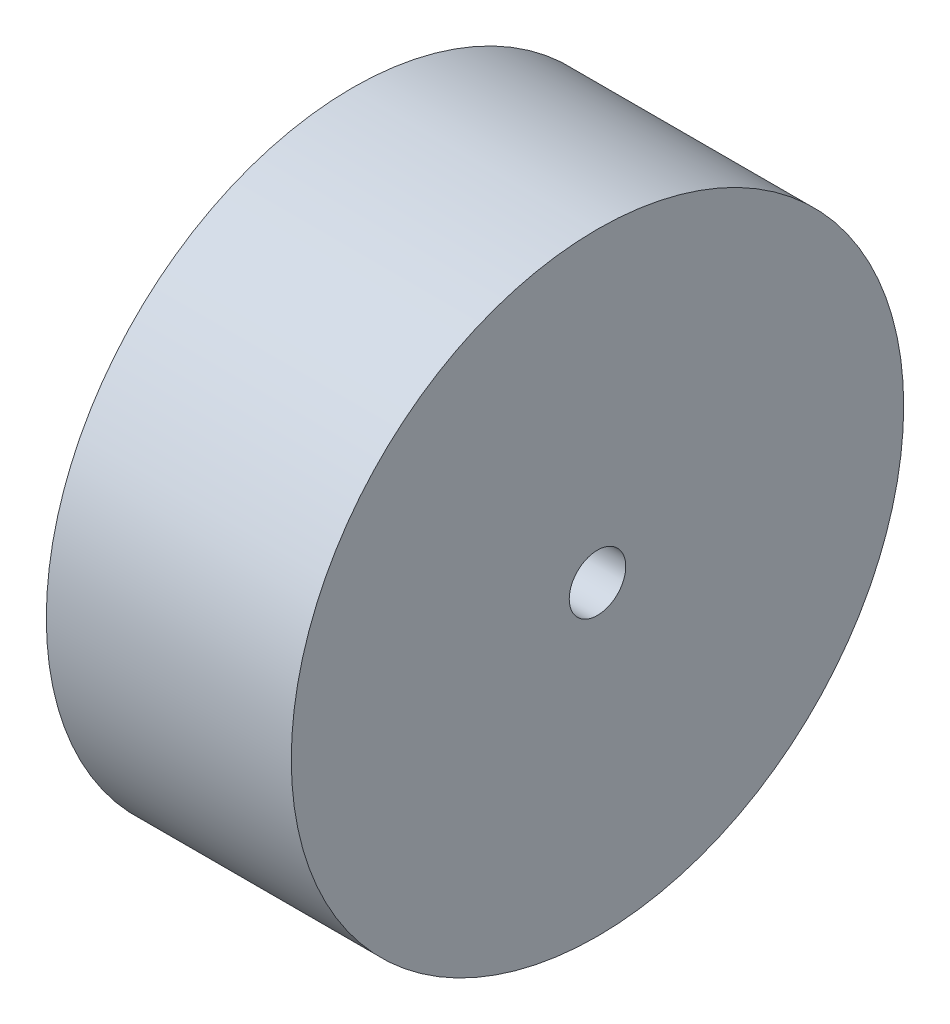
ISO-10303-21;
HEADER;
FILE_DESCRIPTION(('STEP AP214'),'2;1');
FILE_NAME('part.step','',(''),(''),'','','');
FILE_SCHEMA(('AUTOMOTIVE_DESIGN { 1 0 10303 214 1 1 1 1 }'));
ENDSEC;
DATA;
#1=APPLICATION_CONTEXT('core data for automotive mechanical design processes');
#2=APPLICATION_PROTOCOL_DEFINITION('international standard','automotive_design',2000,#1);
#3=PRODUCT_CONTEXT('',#1,'mechanical');
#4=PRODUCT('Part','Part','',(#3));
#5=PRODUCT_RELATED_PRODUCT_CATEGORY('part','',(#4));
#6=PRODUCT_DEFINITION_FORMATION('','',#4);
#7=PRODUCT_DEFINITION_CONTEXT('part definition',#1,'design');
#8=PRODUCT_DEFINITION('design','',#6,#7);
#9=PRODUCT_DEFINITION_SHAPE('','',#8);
#10=(LENGTH_UNIT() NAMED_UNIT(*) SI_UNIT(.MILLI.,.METRE.));
#11=(NAMED_UNIT(*) PLANE_ANGLE_UNIT() SI_UNIT($,.RADIAN.));
#12=(NAMED_UNIT(*) SI_UNIT($,.STERADIAN.) SOLID_ANGLE_UNIT());
#13=UNCERTAINTY_MEASURE_WITH_UNIT(LENGTH_MEASURE(1.E-05),#10,'distance_accuracy_value','');
#14=(GEOMETRIC_REPRESENTATION_CONTEXT(3) GLOBAL_UNCERTAINTY_ASSIGNED_CONTEXT((#13)) GLOBAL_UNIT_ASSIGNED_CONTEXT((#10,
#11,#12)) REPRESENTATION_CONTEXT('',''));
#15=CARTESIAN_POINT('',(0.,0.,0.));
#16=DIRECTION('',(0.,0.,1.));
#17=DIRECTION('',(1.,0.,0.));
#18=AXIS2_PLACEMENT_3D('',#15,#16,#17);
#19=CARTESIAN_POINT('',(26.,0.,0.));
#20=DIRECTION('',(1.,0.,0.));
#21=DIRECTION('',(0.,0.,-1.));
#22=AXIS2_PLACEMENT_3D('',#19,#20,#21);
#23=PLANE('',#22);
#24=CARTESIAN_POINT('',(26.,0.,0.));
#25=DIRECTION('',(1.,0.,0.));
#26=DIRECTION('',(0.,0.,-1.));
#27=AXIS2_PLACEMENT_3D('',#24,#25,#26);
#28=CIRCLE('',#27,32.5);
#29=CARTESIAN_POINT('',(26.,0.,32.5));
#30=VERTEX_POINT('',#29);
#31=EDGE_CURVE('E11',#30,#30,#28,.T.);
#32=ORIENTED_EDGE('',*,*,#31,.T.);
#33=EDGE_LOOP('',(#32));
#34=FACE_BOUND('',#33,.T.);
#35=CARTESIAN_POINT('',(26.,0.,0.));
#36=DIRECTION('',(1.,0.,0.));
#37=DIRECTION('',(0.,0.,-1.));
#38=AXIS2_PLACEMENT_3D('',#35,#36,#37);
#39=CIRCLE('',#38,3.);
#40=CARTESIAN_POINT('',(26.,0.,3.));
#41=VERTEX_POINT('',#40);
#42=EDGE_CURVE('E49',#41,#41,#39,.T.);
#43=ORIENTED_EDGE('',*,*,#42,.F.);
#44=EDGE_LOOP('',(#43));
#45=FACE_BOUND('',#44,.T.);
#46=ADVANCED_FACE('F38',(#34,#45),#23,.T.);
#47=CARTESIAN_POINT('',(0.,0.,0.));
#48=DIRECTION('',(1.,0.,0.));
#49=DIRECTION('',(0.,0.,-1.));
#50=AXIS2_PLACEMENT_3D('',#47,#48,#49);
#51=PLANE('',#50);
#52=CARTESIAN_POINT('',(0.,0.,0.));
#53=DIRECTION('',(1.,0.,0.));
#54=DIRECTION('',(0.,0.,-1.));
#55=AXIS2_PLACEMENT_3D('',#52,#53,#54);
#56=CIRCLE('',#55,32.5);
#57=CARTESIAN_POINT('',(0.,0.,32.5));
#58=VERTEX_POINT('',#57);
#59=EDGE_CURVE('E42',#58,#58,#56,.T.);
#60=ORIENTED_EDGE('',*,*,#59,.F.);
#61=EDGE_LOOP('',(#60));
#62=FACE_BOUND('',#61,.T.);
#63=CARTESIAN_POINT('',(0.,0.,0.));
#64=DIRECTION('',(1.,0.,0.));
#65=DIRECTION('',(0.,0.,-1.));
#66=AXIS2_PLACEMENT_3D('',#63,#64,#65);
#67=CIRCLE('',#66,3.);
#68=CARTESIAN_POINT('',(0.,0.,3.));
#69=VERTEX_POINT('',#68);
#70=EDGE_CURVE('E51',#69,#69,#67,.T.);
#71=ORIENTED_EDGE('',*,*,#70,.T.);
#72=EDGE_LOOP('',(#71));
#73=FACE_BOUND('',#72,.T.);
#74=ADVANCED_FACE('F61',(#62,#73),#51,.F.);
#75=CARTESIAN_POINT('',(26.,0.,0.));
#76=DIRECTION('',(-1.,0.,0.));
#77=DIRECTION('',(0.,0.,1.));
#78=AXIS2_PLACEMENT_3D('',#75,#76,#77);
#79=CYLINDRICAL_SURFACE('',#78,32.5);
#80=CARTESIAN_POINT('',(26.,0.,32.5));
#81=CARTESIAN_POINT('',(25.7291666666667,0.,32.5));
#82=CARTESIAN_POINT('',(25.4583333333333,0.,32.5));
#83=CARTESIAN_POINT('',(24.9166666666667,0.,32.5));
#84=CARTESIAN_POINT('',(24.6458333333333,0.,32.5));
#85=CARTESIAN_POINT('',(24.1041666666667,0.,32.5));
#86=CARTESIAN_POINT('',(23.8333333333333,0.,32.5));
#87=CARTESIAN_POINT('',(23.2916666666667,0.,32.5));
#88=CARTESIAN_POINT('',(23.0208333333333,0.,32.5));
#89=CARTESIAN_POINT('',(22.4791666666667,0.,32.5));
#90=CARTESIAN_POINT('',(22.2083333333333,0.,32.5));
#91=CARTESIAN_POINT('',(21.6666666666667,0.,32.5));
#92=CARTESIAN_POINT('',(21.3958333333333,0.,32.5));
#93=CARTESIAN_POINT('',(20.8541666666667,0.,32.5));
#94=CARTESIAN_POINT('',(20.5833333333333,0.,32.5));
#95=CARTESIAN_POINT('',(20.0416666666667,0.,32.5));
#96=CARTESIAN_POINT('',(19.7708333333333,0.,32.5));
#97=CARTESIAN_POINT('',(19.2291666666667,0.,32.5));
#98=CARTESIAN_POINT('',(18.9583333333333,0.,32.5));
#99=CARTESIAN_POINT('',(18.4166666666667,0.,32.5));
#100=CARTESIAN_POINT('',(18.1458333333333,0.,32.5));
#101=CARTESIAN_POINT('',(17.6041666666667,0.,32.5));
#102=CARTESIAN_POINT('',(17.3333333333333,0.,32.5));
#103=CARTESIAN_POINT('',(16.7916666666667,0.,32.5));
#104=CARTESIAN_POINT('',(16.5208333333333,0.,32.5));
#105=CARTESIAN_POINT('',(15.9791666666667,0.,32.5));
#106=CARTESIAN_POINT('',(15.7083333333333,0.,32.5));
#107=CARTESIAN_POINT('',(15.1666666666667,0.,32.5));
#108=CARTESIAN_POINT('',(14.8958333333333,0.,32.5));
#109=CARTESIAN_POINT('',(14.3541666666667,0.,32.5));
#110=CARTESIAN_POINT('',(14.0833333333333,0.,32.5));
#111=CARTESIAN_POINT('',(13.5416666666667,0.,32.5));
#112=CARTESIAN_POINT('',(13.2708333333333,0.,32.5));
#113=CARTESIAN_POINT('',(12.7291666666667,0.,32.5));
#114=CARTESIAN_POINT('',(12.4583333333333,0.,32.5));
#115=CARTESIAN_POINT('',(11.9166666666667,0.,32.5));
#116=CARTESIAN_POINT('',(11.6458333333333,0.,32.5));
#117=CARTESIAN_POINT('',(11.1041666666667,0.,32.5));
#118=CARTESIAN_POINT('',(10.8333333333333,0.,32.5));
#119=CARTESIAN_POINT('',(10.2916666666667,0.,32.5));
#120=CARTESIAN_POINT('',(10.0208333333333,0.,32.5));
#121=CARTESIAN_POINT('',(9.47916666666667,0.,32.5));
#122=CARTESIAN_POINT('',(9.20833333333333,0.,32.5));
#123=CARTESIAN_POINT('',(8.66666666666667,0.,32.5));
#124=CARTESIAN_POINT('',(8.39583333333333,0.,32.5));
#125=CARTESIAN_POINT('',(7.85416666666667,0.,32.5));
#126=CARTESIAN_POINT('',(7.58333333333333,0.,32.5));
#127=CARTESIAN_POINT('',(7.04166666666667,0.,32.5));
#128=CARTESIAN_POINT('',(6.77083333333333,0.,32.5));
#129=CARTESIAN_POINT('',(6.22916666666667,0.,32.5));
#130=CARTESIAN_POINT('',(5.95833333333333,0.,32.5));
#131=CARTESIAN_POINT('',(5.41666666666667,0.,32.5));
#132=CARTESIAN_POINT('',(5.14583333333333,0.,32.5));
#133=CARTESIAN_POINT('',(4.60416666666667,0.,32.5));
#134=CARTESIAN_POINT('',(4.33333333333333,0.,32.5));
#135=CARTESIAN_POINT('',(3.79166666666667,0.,32.5));
#136=CARTESIAN_POINT('',(3.52083333333333,0.,32.5));
#137=CARTESIAN_POINT('',(2.97916666666667,0.,32.5));
#138=CARTESIAN_POINT('',(2.70833333333333,0.,32.5));
#139=CARTESIAN_POINT('',(2.16666666666667,0.,32.5));
#140=CARTESIAN_POINT('',(1.89583333333333,0.,32.5));
#141=CARTESIAN_POINT('',(1.35416666666667,0.,32.5));
#142=CARTESIAN_POINT('',(1.08333333333333,0.,32.5));
#143=CARTESIAN_POINT('',(0.541666666666667,0.,32.5));
#144=CARTESIAN_POINT('',(0.270833333333334,0.,32.5));
#145=CARTESIAN_POINT('',(0.,0.,32.5));
#146=B_SPLINE_CURVE_WITH_KNOTS('',3,(#80,#81,#82,#83,#84,#85,#86,#87,#88,#89,#90,#91,#92,#93,
#94,#95,#96,#97,#98,#99,#100,#101,#102,#103,#104,#105,#106,#107,#108,#109,#110,#111,#112,#113,
#114,#115,#116,#117,#118,#119,#120,#121,#122,#123,#124,#125,#126,#127,#128,#129,#130,#131,#132,
#133,#134,#135,#136,#137,#138,#139,#140,#141,#142,#143,#144,#145),.UNSPECIFIED.,.F.,.F.,(4,2,2,
2,2,2,2,2,2,2,2,2,2,2,2,2,2,2,2,2,2,2,2,2,2,2,2,2,2,2,2,2,4),(0.,0.812500000000001,1.625,2.4375,
3.25,4.0625,4.875,5.6875,6.5,7.3125,8.125,8.9375,9.75,10.5625,11.375,12.1875,13.,13.8125,14.625,
15.4375,16.25,17.0625,17.875,18.6875,19.5,20.3125,21.125,21.9375,22.75,23.5625,24.375,25.1875,
26.),.UNSPECIFIED.);
#147=EDGE_CURVE('BSEAM40',#30,#58,#146,.T.);
#148=ORIENTED_EDGE('',*,*,#31,.F.);
#149=ORIENTED_EDGE('',*,*,#59,.T.);
#150=ORIENTED_EDGE('',*,*,#147,.T.);
#151=ORIENTED_EDGE('',*,*,#147,.F.);
#152=EDGE_LOOP('',(#148,#150,#149,#151));
#153=FACE_BOUND('',#152,.T.);
#154=ADVANCED_FACE('F40',(#153),#79,.T.);
#155=CARTESIAN_POINT('',(26.,0.,0.));
#156=DIRECTION('',(-1.,0.,0.));
#157=DIRECTION('',(0.,0.,1.));
#158=AXIS2_PLACEMENT_3D('',#155,#156,#157);
#159=CYLINDRICAL_SURFACE('',#158,3.);
#160=CARTESIAN_POINT('',(26.,0.,3.));
#161=CARTESIAN_POINT('',(25.7291666666667,0.,3.));
#162=CARTESIAN_POINT('',(25.4583333333333,0.,3.));
#163=CARTESIAN_POINT('',(24.9166666666667,0.,3.));
#164=CARTESIAN_POINT('',(24.6458333333333,0.,3.));
#165=CARTESIAN_POINT('',(24.1041666666667,0.,3.));
#166=CARTESIAN_POINT('',(23.8333333333333,0.,3.));
#167=CARTESIAN_POINT('',(23.2916666666667,0.,3.));
#168=CARTESIAN_POINT('',(23.0208333333333,0.,3.));
#169=CARTESIAN_POINT('',(22.4791666666667,0.,3.));
#170=CARTESIAN_POINT('',(22.2083333333333,0.,3.));
#171=CARTESIAN_POINT('',(21.6666666666667,0.,3.));
#172=CARTESIAN_POINT('',(21.3958333333333,0.,3.));
#173=CARTESIAN_POINT('',(20.8541666666667,0.,3.));
#174=CARTESIAN_POINT('',(20.5833333333333,0.,3.));
#175=CARTESIAN_POINT('',(20.0416666666667,0.,3.));
#176=CARTESIAN_POINT('',(19.7708333333333,0.,3.));
#177=CARTESIAN_POINT('',(19.2291666666667,0.,3.));
#178=CARTESIAN_POINT('',(18.9583333333333,0.,3.));
#179=CARTESIAN_POINT('',(18.4166666666667,0.,3.));
#180=CARTESIAN_POINT('',(18.1458333333333,0.,3.));
#181=CARTESIAN_POINT('',(17.6041666666667,0.,3.));
#182=CARTESIAN_POINT('',(17.3333333333333,0.,3.));
#183=CARTESIAN_POINT('',(16.7916666666667,0.,3.));
#184=CARTESIAN_POINT('',(16.5208333333333,0.,3.));
#185=CARTESIAN_POINT('',(15.9791666666667,0.,3.));
#186=CARTESIAN_POINT('',(15.7083333333333,0.,3.));
#187=CARTESIAN_POINT('',(15.1666666666667,0.,3.));
#188=CARTESIAN_POINT('',(14.8958333333333,0.,3.));
#189=CARTESIAN_POINT('',(14.3541666666667,0.,3.));
#190=CARTESIAN_POINT('',(14.0833333333333,0.,3.));
#191=CARTESIAN_POINT('',(13.5416666666667,0.,3.));
#192=CARTESIAN_POINT('',(13.2708333333333,0.,3.));
#193=CARTESIAN_POINT('',(12.7291666666667,0.,3.));
#194=CARTESIAN_POINT('',(12.4583333333333,0.,3.));
#195=CARTESIAN_POINT('',(11.9166666666667,0.,3.));
#196=CARTESIAN_POINT('',(11.6458333333333,0.,3.));
#197=CARTESIAN_POINT('',(11.1041666666667,0.,3.));
#198=CARTESIAN_POINT('',(10.8333333333333,0.,3.));
#199=CARTESIAN_POINT('',(10.2916666666667,0.,3.));
#200=CARTESIAN_POINT('',(10.0208333333333,0.,3.));
#201=CARTESIAN_POINT('',(9.47916666666667,0.,3.));
#202=CARTESIAN_POINT('',(9.20833333333333,0.,3.));
#203=CARTESIAN_POINT('',(8.66666666666667,0.,3.));
#204=CARTESIAN_POINT('',(8.39583333333333,0.,3.));
#205=CARTESIAN_POINT('',(7.85416666666667,0.,3.));
#206=CARTESIAN_POINT('',(7.58333333333333,0.,3.));
#207=CARTESIAN_POINT('',(7.04166666666667,0.,3.));
#208=CARTESIAN_POINT('',(6.77083333333333,0.,3.));
#209=CARTESIAN_POINT('',(6.22916666666667,0.,3.));
#210=CARTESIAN_POINT('',(5.95833333333333,0.,3.));
#211=CARTESIAN_POINT('',(5.41666666666667,0.,3.));
#212=CARTESIAN_POINT('',(5.14583333333333,0.,3.));
#213=CARTESIAN_POINT('',(4.60416666666667,0.,3.));
#214=CARTESIAN_POINT('',(4.33333333333333,0.,3.));
#215=CARTESIAN_POINT('',(3.79166666666667,0.,3.));
#216=CARTESIAN_POINT('',(3.52083333333333,0.,3.));
#217=CARTESIAN_POINT('',(2.97916666666667,0.,3.));
#218=CARTESIAN_POINT('',(2.70833333333333,0.,3.));
#219=CARTESIAN_POINT('',(2.16666666666667,0.,3.));
#220=CARTESIAN_POINT('',(1.89583333333333,0.,3.));
#221=CARTESIAN_POINT('',(1.35416666666667,0.,3.));
#222=CARTESIAN_POINT('',(1.08333333333333,0.,3.));
#223=CARTESIAN_POINT('',(0.541666666666667,0.,3.));
#224=CARTESIAN_POINT('',(0.270833333333334,0.,3.));
#225=CARTESIAN_POINT('',(0.,0.,3.));
#226=B_SPLINE_CURVE_WITH_KNOTS('',3,(#160,#161,#162,#163,#164,#165,#166,#167,#168,#169,#170,
#171,#172,#173,#174,#175,#176,#177,#178,#179,#180,#181,#182,#183,#184,#185,#186,#187,#188,#189,
#190,#191,#192,#193,#194,#195,#196,#197,#198,#199,#200,#201,#202,#203,#204,#205,#206,#207,#208,
#209,#210,#211,#212,#213,#214,#215,#216,#217,#218,#219,#220,#221,#222,#223,#224,#225),
.UNSPECIFIED.,.F.,.F.,(4,2,2,2,2,2,2,2,2,2,2,2,2,2,2,2,2,2,2,2,2,2,2,2,2,2,2,2,2,2,2,2,4),(0.,
0.812500000000001,1.625,2.4375,3.25,4.0625,4.875,5.6875,6.5,7.3125,8.125,8.9375,9.75,10.5625,
11.375,12.1875,13.,13.8125,14.625,15.4375,16.25,17.0625,17.875,18.6875,19.5,20.3125,21.125,
21.9375,22.75,23.5625,24.375,25.1875,26.),.UNSPECIFIED.);
#227=EDGE_CURVE('BSEAM57',#41,#69,#226,.T.);
#228=ORIENTED_EDGE('',*,*,#42,.T.);
#229=ORIENTED_EDGE('',*,*,#70,.F.);
#230=ORIENTED_EDGE('',*,*,#227,.T.);
#231=ORIENTED_EDGE('',*,*,#227,.F.);
#232=EDGE_LOOP('',(#228,#230,#229,#231));
#233=FACE_BOUND('',#232,.T.);
#234=ADVANCED_FACE('F57',(#233),#159,.F.);
#235=CLOSED_SHELL('',(#46,#74,#154,#234));
#236=MANIFOLD_SOLID_BREP('B2',#235);
#237=ADVANCED_BREP_SHAPE_REPRESENTATION('',(#18,#236),#14);
#238=SHAPE_DEFINITION_REPRESENTATION(#9,#237);
ENDSEC;
END-ISO-10303-21;
